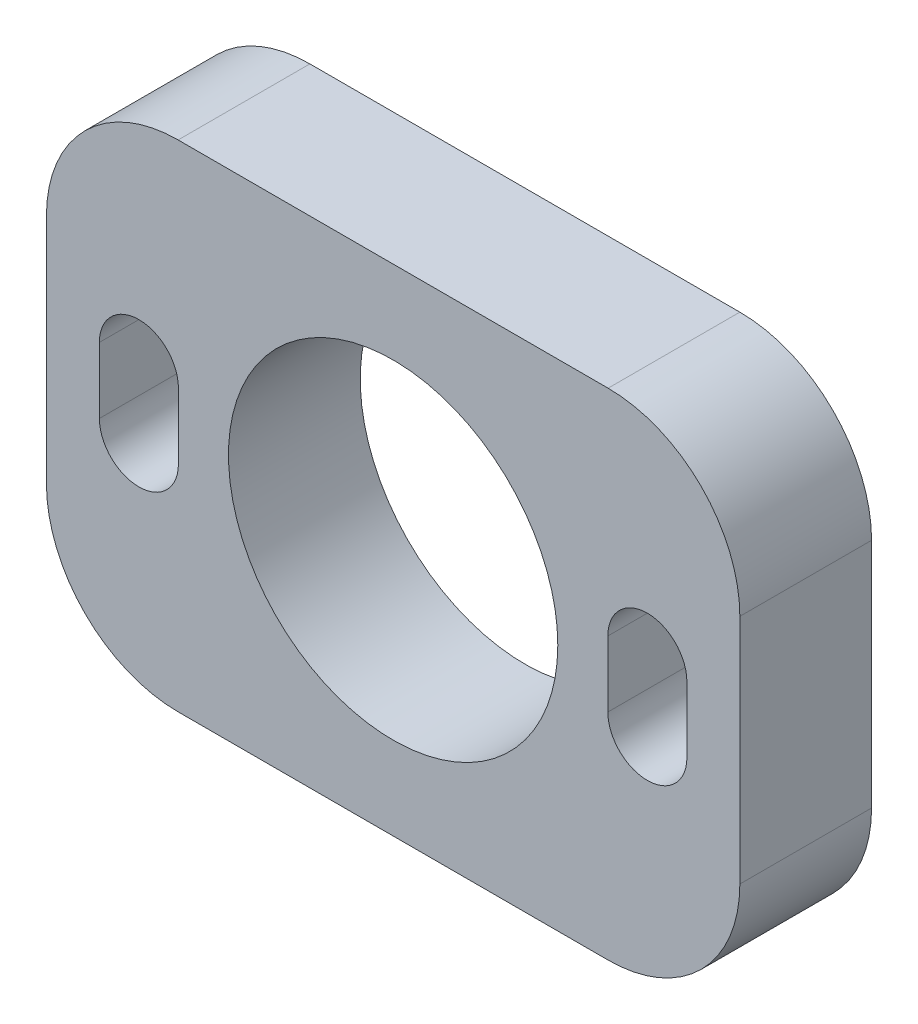
ISO-10303-21;
HEADER;
FILE_DESCRIPTION(('STEP AP214'),'2;1');
FILE_NAME('part.step','',(''),(''),'','','');
FILE_SCHEMA(('AUTOMOTIVE_DESIGN { 1 0 10303 214 1 1 1 1 }'));
ENDSEC;
DATA;
#1=APPLICATION_CONTEXT('core data for automotive mechanical design processes');
#2=APPLICATION_PROTOCOL_DEFINITION('international standard','automotive_design',2000,#1);
#3=PRODUCT_CONTEXT('',#1,'mechanical');
#4=PRODUCT('Part','Part','',(#3));
#5=PRODUCT_RELATED_PRODUCT_CATEGORY('part','',(#4));
#6=PRODUCT_DEFINITION_FORMATION('','',#4);
#7=PRODUCT_DEFINITION_CONTEXT('part definition',#1,'design');
#8=PRODUCT_DEFINITION('design','',#6,#7);
#9=PRODUCT_DEFINITION_SHAPE('','',#8);
#10=(LENGTH_UNIT() NAMED_UNIT(*) SI_UNIT(.MILLI.,.METRE.));
#11=(NAMED_UNIT(*) PLANE_ANGLE_UNIT() SI_UNIT($,.RADIAN.));
#12=(NAMED_UNIT(*) SI_UNIT($,.STERADIAN.) SOLID_ANGLE_UNIT());
#13=UNCERTAINTY_MEASURE_WITH_UNIT(LENGTH_MEASURE(1.E-05),#10,'distance_accuracy_value','');
#14=(GEOMETRIC_REPRESENTATION_CONTEXT(3) GLOBAL_UNCERTAINTY_ASSIGNED_CONTEXT((#13)) GLOBAL_UNIT_ASSIGNED_CONTEXT((#10,
#11,#12)) REPRESENTATION_CONTEXT('',''));
#15=CARTESIAN_POINT('',(0.,0.,0.));
#16=DIRECTION('',(0.,0.,1.));
#17=DIRECTION('',(1.,0.,0.));
#18=AXIS2_PLACEMENT_3D('',#15,#16,#17);
#19=CARTESIAN_POINT('',(27.559822218472,26.2909678017719,-88.6894036822282));
#20=DIRECTION('',(0.,0.,-1.));
#21=DIRECTION('',(-1.,0.,0.));
#22=AXIS2_PLACEMENT_3D('',#19,#20,#21);
#23=CYLINDRICAL_SURFACE('',#22,1.905);
#24=CARTESIAN_POINT('',(27.559822218472,26.2909678017719,-95.0394036822282));
#25=DIRECTION('',(0.,0.,1.));
#26=DIRECTION('',(1.,0.,0.));
#27=AXIS2_PLACEMENT_3D('',#24,#25,#26);
#28=CIRCLE('',#27,1.905);
#29=CARTESIAN_POINT('',(29.464822218472,26.2909678017719,-95.0394036822282));
#30=VERTEX_POINT('',#29);
#31=CARTESIAN_POINT('',(25.654822218472,26.2909678017719,-95.0394036822282));
#32=VERTEX_POINT('',#31);
#33=EDGE_CURVE('E222',#30,#32,#28,.T.);
#34=ORIENTED_EDGE('',*,*,#33,.F.);
#35=DIRECTION('',(0.,0.,-1.));
#36=VECTOR('',#35,1.);
#37=CARTESIAN_POINT('',(29.464822218472,26.2909678017719,-88.6894036822282));
#38=LINE('',#37,#36);
#39=CARTESIAN_POINT('',(29.464822218472,26.2909678017719,-88.6894036822282));
#40=VERTEX_POINT('',#39);
#41=EDGE_CURVE('E239',#40,#30,#38,.T.);
#42=ORIENTED_EDGE('',*,*,#41,.F.);
#43=CARTESIAN_POINT('',(27.559822218472,26.2909678017719,-88.6894036822282));
#44=DIRECTION('',(0.,0.,1.));
#45=DIRECTION('',(1.,0.,0.));
#46=AXIS2_PLACEMENT_3D('',#43,#44,#45);
#47=CIRCLE('',#46,1.905);
#48=CARTESIAN_POINT('',(25.654822218472,26.2909678017719,-88.6894036822282));
#49=VERTEX_POINT('',#48);
#50=EDGE_CURVE('E187',#40,#49,#47,.T.);
#51=ORIENTED_EDGE('',*,*,#50,.T.);
#52=DIRECTION('',(0.,0.,-1.));
#53=VECTOR('',#52,1.);
#54=CARTESIAN_POINT('',(25.654822218472,26.2909678017719,-88.6894036822282));
#55=LINE('',#54,#53);
#56=EDGE_CURVE('E156',#49,#32,#55,.T.);
#57=ORIENTED_EDGE('',*,*,#56,.T.);
#58=EDGE_LOOP('',(#34,#42,#51,#57));
#59=FACE_BOUND('',#58,.T.);
#60=ADVANCED_FACE('F32',(#59),#23,.F.);
#61=CARTESIAN_POINT('',(29.464822218472,0.,-88.6894036822282));
#62=DIRECTION('',(1.,0.,0.));
#63=DIRECTION('',(0.,0.,-1.));
#64=AXIS2_PLACEMENT_3D('',#61,#62,#63);
#65=PLANE('',#64);
#66=DIRECTION('',(0.,-1.,0.));
#67=VECTOR('',#66,1.);
#68=CARTESIAN_POINT('',(29.464822218472,0.,-95.0394036822282));
#69=LINE('',#68,#67);
#70=CARTESIAN_POINT('',(29.464822218472,23.115967801772,-95.0394036822282));
#71=VERTEX_POINT('',#70);
#72=EDGE_CURVE('E225',#30,#71,#69,.T.);
#73=ORIENTED_EDGE('',*,*,#72,.T.);
#74=DIRECTION('',(0.,0.,-1.));
#75=VECTOR('',#74,1.);
#76=CARTESIAN_POINT('',(29.464822218472,23.115967801772,-88.6894036822282));
#77=LINE('',#76,#75);
#78=CARTESIAN_POINT('',(29.464822218472,23.115967801772,-88.6894036822282));
#79=VERTEX_POINT('',#78);
#80=EDGE_CURVE('E237',#79,#71,#77,.T.);
#81=ORIENTED_EDGE('',*,*,#80,.F.);
#82=DIRECTION('',(0.,-1.,0.));
#83=VECTOR('',#82,1.);
#84=CARTESIAN_POINT('',(29.464822218472,0.,-88.6894036822282));
#85=LINE('',#84,#83);
#86=EDGE_CURVE('E190',#40,#79,#85,.T.);
#87=ORIENTED_EDGE('',*,*,#86,.F.);
#88=ORIENTED_EDGE('',*,*,#41,.T.);
#89=EDGE_LOOP('',(#73,#81,#87,#88));
#90=FACE_BOUND('',#89,.T.);
#91=ADVANCED_FACE('F314',(#90),#65,.F.);
#92=CARTESIAN_POINT('',(27.559822218472,23.115967801772,-88.6894036822282));
#93=DIRECTION('',(0.,0.,-1.));
#94=DIRECTION('',(-1.,0.,0.));
#95=AXIS2_PLACEMENT_3D('',#92,#93,#94);
#96=CYLINDRICAL_SURFACE('',#95,1.905);
#97=CARTESIAN_POINT('',(27.559822218472,23.115967801772,-95.0394036822282));
#98=DIRECTION('',(0.,0.,1.));
#99=DIRECTION('',(1.,0.,0.));
#100=AXIS2_PLACEMENT_3D('',#97,#98,#99);
#101=CIRCLE('',#100,1.905);
#102=CARTESIAN_POINT('',(25.654822218472,23.115967801772,-95.0394036822282));
#103=VERTEX_POINT('',#102);
#104=EDGE_CURVE('E228',#103,#71,#101,.T.);
#105=ORIENTED_EDGE('',*,*,#104,.F.);
#106=DIRECTION('',(0.,0.,-1.));
#107=VECTOR('',#106,1.);
#108=CARTESIAN_POINT('',(25.654822218472,23.115967801772,-88.6894036822282));
#109=LINE('',#108,#107);
#110=CARTESIAN_POINT('',(25.654822218472,23.115967801772,-88.6894036822282));
#111=VERTEX_POINT('',#110);
#112=EDGE_CURVE('E235',#111,#103,#109,.T.);
#113=ORIENTED_EDGE('',*,*,#112,.F.);
#114=CARTESIAN_POINT('',(27.559822218472,23.115967801772,-88.6894036822282));
#115=DIRECTION('',(0.,0.,1.));
#116=DIRECTION('',(1.,0.,0.));
#117=AXIS2_PLACEMENT_3D('',#114,#115,#116);
#118=CIRCLE('',#117,1.905);
#119=EDGE_CURVE('E192',#111,#79,#118,.T.);
#120=ORIENTED_EDGE('',*,*,#119,.T.);
#121=ORIENTED_EDGE('',*,*,#80,.T.);
#122=EDGE_LOOP('',(#105,#113,#120,#121));
#123=FACE_BOUND('',#122,.T.);
#124=ADVANCED_FACE('F320',(#123),#96,.F.);
#125=CARTESIAN_POINT('',(32.017522218472,0.,-88.6894036822282));
#126=DIRECTION('',(1.,0.,0.));
#127=DIRECTION('',(0.,0.,-1.));
#128=AXIS2_PLACEMENT_3D('',#125,#126,#127);
#129=PLANE('',#128);
#130=DIRECTION('',(0.,-1.,0.));
#131=VECTOR('',#130,1.);
#132=CARTESIAN_POINT('',(32.017522218472,0.,-95.0394036822282));
#133=LINE('',#132,#131);
#134=CARTESIAN_POINT('',(32.017522218472,30.291467801772,-95.0394036822282));
#135=VERTEX_POINT('',#134);
#136=CARTESIAN_POINT('',(32.017522218472,19.115467801772,-95.0394036822282));
#137=VERTEX_POINT('',#136);
#138=EDGE_CURVE('E211',#135,#137,#133,.T.);
#139=ORIENTED_EDGE('',*,*,#138,.F.);
#140=DIRECTION('',(0.,0.,-1.));
#141=VECTOR('',#140,1.);
#142=CARTESIAN_POINT('',(32.017522218472,30.291467801772,-88.6894036822282));
#143=LINE('',#142,#141);
#144=CARTESIAN_POINT('',(32.017522218472,30.291467801772,-88.6894036822282));
#145=VERTEX_POINT('',#144);
#146=EDGE_CURVE('E261',#135,#145,#143,.F.);
#147=ORIENTED_EDGE('',*,*,#146,.T.);
#148=DIRECTION('',(0.,-1.,0.));
#149=VECTOR('',#148,1.);
#150=CARTESIAN_POINT('',(32.017522218472,0.,-88.6894036822282));
#151=LINE('',#150,#149);
#152=CARTESIAN_POINT('',(32.017522218472,19.115467801772,-88.6894036822282));
#153=VERTEX_POINT('',#152);
#154=EDGE_CURVE('E177',#145,#153,#151,.T.);
#155=ORIENTED_EDGE('',*,*,#154,.T.);
#156=DIRECTION('',(0.,0.,-1.));
#157=VECTOR('',#156,1.);
#158=CARTESIAN_POINT('',(32.017522218472,19.115467801772,-95.0394036822282));
#159=LINE('',#158,#157);
#160=EDGE_CURVE('E258',#153,#137,#159,.T.);
#161=ORIENTED_EDGE('',*,*,#160,.T.);
#162=EDGE_LOOP('',(#139,#147,#155,#161));
#163=FACE_BOUND('',#162,.T.);
#164=ADVANCED_FACE('F299',(#163),#129,.T.);
#165=CARTESIAN_POINT('',(0.,36.641467801772,-88.6894036822282));
#166=DIRECTION('',(0.,1.,0.));
#167=DIRECTION('',(0.,0.,1.));
#168=AXIS2_PLACEMENT_3D('',#165,#166,#167);
#169=PLANE('',#168);
#170=DIRECTION('',(1.,0.,0.));
#171=VECTOR('',#170,1.);
#172=CARTESIAN_POINT('',(0.,36.641467801772,-88.6894036822282));
#173=LINE('',#172,#171);
#174=CARTESIAN_POINT('',(4.94112221847201,36.641467801772,-88.6894036822282));
#175=VERTEX_POINT('',#174);
#176=CARTESIAN_POINT('',(25.667522218472,36.641467801772,-88.6894036822282));
#177=VERTEX_POINT('',#176);
#178=EDGE_CURVE('E180',#175,#177,#173,.T.);
#179=ORIENTED_EDGE('',*,*,#178,.T.);
#180=DIRECTION('',(0.,0.,-1.));
#181=VECTOR('',#180,1.);
#182=CARTESIAN_POINT('',(25.667522218472,36.641467801772,-88.6894036822282));
#183=LINE('',#182,#181);
#184=CARTESIAN_POINT('',(25.667522218472,36.641467801772,-95.0394036822282));
#185=VERTEX_POINT('',#184);
#186=EDGE_CURVE('E247',#177,#185,#183,.T.);
#187=ORIENTED_EDGE('',*,*,#186,.T.);
#188=DIRECTION('',(1.,0.,0.));
#189=VECTOR('',#188,1.);
#190=CARTESIAN_POINT('',(0.,36.641467801772,-95.0394036822282));
#191=LINE('',#190,#189);
#192=CARTESIAN_POINT('',(4.94112221847201,36.641467801772,-95.0394036822282));
#193=VERTEX_POINT('',#192);
#194=EDGE_CURVE('E214',#193,#185,#191,.T.);
#195=ORIENTED_EDGE('',*,*,#194,.F.);
#196=DIRECTION('',(0.,0.,-1.));
#197=VECTOR('',#196,1.);
#198=CARTESIAN_POINT('',(4.94112221847201,36.641467801772,-88.6894036822282));
#199=LINE('',#198,#197);
#200=EDGE_CURVE('E241',#193,#175,#199,.F.);
#201=ORIENTED_EDGE('',*,*,#200,.T.);
#202=EDGE_LOOP('',(#179,#187,#195,#201));
#203=FACE_BOUND('',#202,.T.);
#204=ADVANCED_FACE('F306',(#203),#169,.T.);
#205=CARTESIAN_POINT('',(-1.40887778152798,0.,-88.6894036822282));
#206=DIRECTION('',(1.,0.,0.));
#207=DIRECTION('',(0.,1.,0.));
#208=AXIS2_PLACEMENT_3D('',#205,#206,#207);
#209=PLANE('',#208);
#210=DIRECTION('',(0.,-1.,0.));
#211=VECTOR('',#210,1.);
#212=CARTESIAN_POINT('',(-1.40887778152798,0.,-95.0394036822282));
#213=LINE('',#212,#211);
#214=CARTESIAN_POINT('',(-1.40887778152799,30.291467801772,-95.0394036822282));
#215=VERTEX_POINT('',#214);
#216=CARTESIAN_POINT('',(-1.40887778152798,19.115467801772,-95.0394036822282));
#217=VERTEX_POINT('',#216);
#218=EDGE_CURVE('E217',#215,#217,#213,.T.);
#219=ORIENTED_EDGE('',*,*,#218,.T.);
#220=DIRECTION('',(0.,0.,-1.));
#221=VECTOR('',#220,1.);
#222=CARTESIAN_POINT('',(-1.40887778152798,19.115467801772,-88.6894036822282));
#223=LINE('',#222,#221);
#224=CARTESIAN_POINT('',(-1.40887778152798,19.115467801772,-88.6894036822282));
#225=VERTEX_POINT('',#224);
#226=EDGE_CURVE('E11',#217,#225,#223,.F.);
#227=ORIENTED_EDGE('',*,*,#226,.T.);
#228=DIRECTION('',(0.,-1.,0.));
#229=VECTOR('',#228,1.);
#230=CARTESIAN_POINT('',(-1.40887778152798,0.,-88.6894036822282));
#231=LINE('',#230,#229);
#232=CARTESIAN_POINT('',(-1.40887778152799,30.291467801772,-88.6894036822282));
#233=VERTEX_POINT('',#232);
#234=EDGE_CURVE('E183',#233,#225,#231,.T.);
#235=ORIENTED_EDGE('',*,*,#234,.F.);
#236=DIRECTION('',(0.,0.,-1.));
#237=VECTOR('',#236,1.);
#238=CARTESIAN_POINT('',(-1.40887778152799,30.291467801772,-95.0394036822282));
#239=LINE('',#238,#237);
#240=EDGE_CURVE('E40',#233,#215,#239,.T.);
#241=ORIENTED_EDGE('',*,*,#240,.T.);
#242=EDGE_LOOP('',(#219,#227,#235,#241));
#243=FACE_BOUND('',#242,.T.);
#244=ADVANCED_FACE('F278',(#243),#209,.F.);
#245=CARTESIAN_POINT('',(3.04882221847201,23.115967801772,-88.6894036822282));
#246=DIRECTION('',(0.,0.,-1.));
#247=DIRECTION('',(-1.,0.,0.));
#248=AXIS2_PLACEMENT_3D('',#245,#246,#247);
#249=CYLINDRICAL_SURFACE('',#248,1.905);
#250=CARTESIAN_POINT('',(3.04882221847201,23.115967801772,-95.0394036822282));
#251=DIRECTION('',(0.,0.,1.));
#252=DIRECTION('',(1.,0.,0.));
#253=AXIS2_PLACEMENT_3D('',#250,#251,#252);
#254=CIRCLE('',#253,1.905);
#255=CARTESIAN_POINT('',(1.14382221847201,23.115967801772,-95.0394036822282));
#256=VERTEX_POINT('',#255);
#257=CARTESIAN_POINT('',(4.95382221847201,23.115967801772,-95.0394036822282));
#258=VERTEX_POINT('',#257);
#259=EDGE_CURVE('E151',#256,#258,#254,.T.);
#260=ORIENTED_EDGE('',*,*,#259,.F.);
#261=DIRECTION('',(0.,0.,-1.));
#262=VECTOR('',#261,1.);
#263=CARTESIAN_POINT('',(1.14382221847201,23.115967801772,-88.6894036822282));
#264=LINE('',#263,#262);
#265=CARTESIAN_POINT('',(1.14382221847201,23.115967801772,-88.6894036822282));
#266=VERTEX_POINT('',#265);
#267=EDGE_CURVE('E146',#266,#256,#264,.T.);
#268=ORIENTED_EDGE('',*,*,#267,.F.);
#269=CARTESIAN_POINT('',(3.04882221847201,23.115967801772,-88.6894036822282));
#270=DIRECTION('',(0.,0.,1.));
#271=DIRECTION('',(1.,0.,0.));
#272=AXIS2_PLACEMENT_3D('',#269,#270,#271);
#273=CIRCLE('',#272,1.905);
#274=CARTESIAN_POINT('',(4.95382221847201,23.115967801772,-88.6894036822282));
#275=VERTEX_POINT('',#274);
#276=EDGE_CURVE('E149',#266,#275,#273,.T.);
#277=ORIENTED_EDGE('',*,*,#276,.T.);
#278=DIRECTION('',(0.,0.,-1.));
#279=VECTOR('',#278,1.);
#280=CARTESIAN_POINT('',(4.95382221847201,23.115967801772,-88.6894036822282));
#281=LINE('',#280,#279);
#282=EDGE_CURVE('E198',#275,#258,#281,.T.);
#283=ORIENTED_EDGE('',*,*,#282,.T.);
#284=EDGE_LOOP('',(#260,#268,#277,#283));
#285=FACE_BOUND('',#284,.T.);
#286=ADVANCED_FACE('F148',(#285),#249,.F.);
#287=CARTESIAN_POINT('',(1.14382221847201,0.,-88.6894036822282));
#288=DIRECTION('',(1.,0.,0.));
#289=DIRECTION('',(0.,0.,-1.));
#290=AXIS2_PLACEMENT_3D('',#287,#288,#289);
#291=PLANE('',#290);
#292=DIRECTION('',(0.,-1.,0.));
#293=VECTOR('',#292,1.);
#294=CARTESIAN_POINT('',(1.14382221847201,0.,-95.0394036822282));
#295=LINE('',#294,#293);
#296=CARTESIAN_POINT('',(1.14382221847201,26.2909678017719,-95.0394036822282));
#297=VERTEX_POINT('',#296);
#298=EDGE_CURVE('E203',#297,#256,#295,.T.);
#299=ORIENTED_EDGE('',*,*,#298,.F.);
#300=DIRECTION('',(0.,0.,-1.));
#301=VECTOR('',#300,1.);
#302=CARTESIAN_POINT('',(1.14382221847201,26.2909678017719,-88.6894036822282));
#303=LINE('',#302,#301);
#304=CARTESIAN_POINT('',(1.14382221847201,26.2909678017719,-88.6894036822282));
#305=VERTEX_POINT('',#304);
#306=EDGE_CURVE('E157',#305,#297,#303,.T.);
#307=ORIENTED_EDGE('',*,*,#306,.F.);
#308=DIRECTION('',(0.,-1.,0.));
#309=VECTOR('',#308,1.);
#310=CARTESIAN_POINT('',(1.14382221847201,0.,-88.6894036822282));
#311=LINE('',#310,#309);
#312=EDGE_CURVE('E163',#305,#266,#311,.T.);
#313=ORIENTED_EDGE('',*,*,#312,.T.);
#314=ORIENTED_EDGE('',*,*,#267,.T.);
#315=EDGE_LOOP('',(#299,#307,#313,#314));
#316=FACE_BOUND('',#315,.T.);
#317=ADVANCED_FACE('F170',(#316),#291,.T.);
#318=CARTESIAN_POINT('',(3.04882221847201,26.2909678017719,-88.6894036822282));
#319=DIRECTION('',(0.,0.,-1.));
#320=DIRECTION('',(-1.,0.,0.));
#321=AXIS2_PLACEMENT_3D('',#318,#319,#320);
#322=CYLINDRICAL_SURFACE('',#321,1.905);
#323=CARTESIAN_POINT('',(3.04882221847201,26.2909678017719,-95.0394036822282));
#324=DIRECTION('',(0.,0.,1.));
#325=DIRECTION('',(1.,0.,0.));
#326=AXIS2_PLACEMENT_3D('',#323,#324,#325);
#327=CIRCLE('',#326,1.905);
#328=CARTESIAN_POINT('',(4.95382221847201,26.2909678017719,-95.0394036822282));
#329=VERTEX_POINT('',#328);
#330=EDGE_CURVE('E205',#329,#297,#327,.T.);
#331=ORIENTED_EDGE('',*,*,#330,.F.);
#332=DIRECTION('',(0.,0.,-1.));
#333=VECTOR('',#332,1.);
#334=CARTESIAN_POINT('',(4.95382221847201,26.2909678017719,-88.6894036822282));
#335=LINE('',#334,#333);
#336=CARTESIAN_POINT('',(4.95382221847201,26.2909678017719,-88.6894036822282));
#337=VERTEX_POINT('',#336);
#338=EDGE_CURVE('E243',#337,#329,#335,.T.);
#339=ORIENTED_EDGE('',*,*,#338,.F.);
#340=CARTESIAN_POINT('',(3.04882221847201,26.2909678017719,-88.6894036822282));
#341=DIRECTION('',(0.,0.,1.));
#342=DIRECTION('',(1.,0.,0.));
#343=AXIS2_PLACEMENT_3D('',#340,#341,#342);
#344=CIRCLE('',#343,1.905);
#345=EDGE_CURVE('E171',#337,#305,#344,.T.);
#346=ORIENTED_EDGE('',*,*,#345,.T.);
#347=ORIENTED_EDGE('',*,*,#306,.T.);
#348=EDGE_LOOP('',(#331,#339,#346,#347));
#349=FACE_BOUND('',#348,.T.);
#350=ADVANCED_FACE('F329',(#349),#322,.F.);
#351=CARTESIAN_POINT('',(0.,12.7654678017719,-88.6894036822282));
#352=DIRECTION('',(0.,1.,0.));
#353=DIRECTION('',(0.,0.,1.));
#354=AXIS2_PLACEMENT_3D('',#351,#352,#353);
#355=PLANE('',#354);
#356=DIRECTION('',(1.,0.,0.));
#357=VECTOR('',#356,1.);
#358=CARTESIAN_POINT('',(0.,12.7654678017719,-95.0394036822282));
#359=LINE('',#358,#357);
#360=CARTESIAN_POINT('',(4.94112221847201,12.7654678017719,-95.0394036822282));
#361=VERTEX_POINT('',#360);
#362=CARTESIAN_POINT('',(25.667522218472,12.7654678017719,-95.0394036822282));
#363=VERTEX_POINT('',#362);
#364=EDGE_CURVE('E220',#361,#363,#359,.T.);
#365=ORIENTED_EDGE('',*,*,#364,.T.);
#366=DIRECTION('',(0.,0.,-1.));
#367=VECTOR('',#366,1.);
#368=CARTESIAN_POINT('',(25.667522218472,12.7654678017719,-88.6894036822282));
#369=LINE('',#368,#367);
#370=CARTESIAN_POINT('',(25.667522218472,12.7654678017719,-88.6894036822282));
#371=VERTEX_POINT('',#370);
#372=EDGE_CURVE('E47',#363,#371,#369,.F.);
#373=ORIENTED_EDGE('',*,*,#372,.T.);
#374=DIRECTION('',(1.,0.,0.));
#375=VECTOR('',#374,1.);
#376=CARTESIAN_POINT('',(0.,12.7654678017719,-88.6894036822282));
#377=LINE('',#376,#375);
#378=CARTESIAN_POINT('',(4.94112221847201,12.7654678017719,-88.6894036822282));
#379=VERTEX_POINT('',#378);
#380=EDGE_CURVE('E185',#379,#371,#377,.T.);
#381=ORIENTED_EDGE('',*,*,#380,.F.);
#382=DIRECTION('',(0.,0.,-1.));
#383=VECTOR('',#382,1.);
#384=CARTESIAN_POINT('',(4.94112221847201,12.7654678017719,-88.6894036822282));
#385=LINE('',#384,#383);
#386=EDGE_CURVE('E270',#379,#361,#385,.T.);
#387=ORIENTED_EDGE('',*,*,#386,.T.);
#388=EDGE_LOOP('',(#365,#373,#381,#387));
#389=FACE_BOUND('',#388,.T.);
#390=ADVANCED_FACE('F290',(#389),#355,.F.);
#391=CARTESIAN_POINT('',(4.95382221847201,0.,-88.6894036822282));
#392=DIRECTION('',(1.,0.,0.));
#393=DIRECTION('',(0.,0.,-1.));
#394=AXIS2_PLACEMENT_3D('',#391,#392,#393);
#395=PLANE('',#394);
#396=DIRECTION('',(0.,-1.,0.));
#397=VECTOR('',#396,1.);
#398=CARTESIAN_POINT('',(4.95382221847201,0.,-95.0394036822282));
#399=LINE('',#398,#397);
#400=EDGE_CURVE('E208',#329,#258,#399,.T.);
#401=ORIENTED_EDGE('',*,*,#400,.T.);
#402=ORIENTED_EDGE('',*,*,#282,.F.);
#403=DIRECTION('',(0.,-1.,0.));
#404=VECTOR('',#403,1.);
#405=CARTESIAN_POINT('',(4.95382221847201,0.,-88.6894036822282));
#406=LINE('',#405,#404);
#407=EDGE_CURVE('E166',#337,#275,#406,.T.);
#408=ORIENTED_EDGE('',*,*,#407,.F.);
#409=ORIENTED_EDGE('',*,*,#338,.T.);
#410=EDGE_LOOP('',(#401,#402,#408,#409));
#411=FACE_BOUND('',#410,.T.);
#412=ADVANCED_FACE('F328',(#411),#395,.F.);
#413=CARTESIAN_POINT('',(15.304322218472,24.703467801772,-88.6894036822282));
#414=DIRECTION('',(0.,0.,-1.));
#415=DIRECTION('',(-1.,0.,0.));
#416=AXIS2_PLACEMENT_3D('',#413,#414,#415);
#417=CYLINDRICAL_SURFACE('',#416,7.9375);
#418=CARTESIAN_POINT('',(15.304322218472,24.703467801772,-88.6894036822282));
#419=DIRECTION('',(0.,0.,1.));
#420=DIRECTION('',(1.,0.,0.));
#421=AXIS2_PLACEMENT_3D('',#418,#419,#420);
#422=CIRCLE('',#421,7.9375);
#423=CARTESIAN_POINT('',(23.241822218472,24.703467801772,-88.6894036822282));
#424=VERTEX_POINT('',#423);
#425=EDGE_CURVE('E168',#424,#424,#422,.T.);
#426=ORIENTED_EDGE('',*,*,#425,.T.);
#427=EDGE_LOOP('',(#426));
#428=FACE_BOUND('',#427,.T.);
#429=CARTESIAN_POINT('',(15.304322218472,24.703467801772,-95.0394036822282));
#430=DIRECTION('',(0.,0.,1.));
#431=DIRECTION('',(1.,0.,0.));
#432=AXIS2_PLACEMENT_3D('',#429,#430,#431);
#433=CIRCLE('',#432,7.9375);
#434=CARTESIAN_POINT('',(23.241822218472,24.703467801772,-95.0394036822282));
#435=VERTEX_POINT('',#434);
#436=EDGE_CURVE('E199',#435,#435,#433,.T.);
#437=ORIENTED_EDGE('',*,*,#436,.F.);
#438=EDGE_LOOP('',(#437));
#439=FACE_BOUND('',#438,.T.);
#440=ADVANCED_FACE('F338',(#428,#439),#417,.F.);
#441=CARTESIAN_POINT('',(25.654822218472,0.,-88.6894036822282));
#442=DIRECTION('',(1.,0.,0.));
#443=DIRECTION('',(0.,0.,-1.));
#444=AXIS2_PLACEMENT_3D('',#441,#442,#443);
#445=PLANE('',#444);
#446=DIRECTION('',(0.,-1.,0.));
#447=VECTOR('',#446,1.);
#448=CARTESIAN_POINT('',(25.654822218472,0.,-95.0394036822282));
#449=LINE('',#448,#447);
#450=EDGE_CURVE('E231',#32,#103,#449,.T.);
#451=ORIENTED_EDGE('',*,*,#450,.F.);
#452=ORIENTED_EDGE('',*,*,#56,.F.);
#453=DIRECTION('',(0.,-1.,0.));
#454=VECTOR('',#453,1.);
#455=CARTESIAN_POINT('',(25.654822218472,0.,-88.6894036822282));
#456=LINE('',#455,#454);
#457=EDGE_CURVE('E195',#49,#111,#456,.T.);
#458=ORIENTED_EDGE('',*,*,#457,.T.);
#459=ORIENTED_EDGE('',*,*,#112,.T.);
#460=EDGE_LOOP('',(#451,#452,#458,#459));
#461=FACE_BOUND('',#460,.T.);
#462=ADVANCED_FACE('F349',(#461),#445,.T.);
#463=CARTESIAN_POINT('',(0.,0.,-88.6894036822282));
#464=DIRECTION('',(0.,0.,1.));
#465=DIRECTION('',(1.,0.,0.));
#466=AXIS2_PLACEMENT_3D('',#463,#464,#465);
#467=PLANE('',#466);
#468=ORIENTED_EDGE('',*,*,#425,.F.);
#469=EDGE_LOOP('',(#468));
#470=FACE_BOUND('',#469,.T.);
#471=ORIENTED_EDGE('',*,*,#276,.F.);
#472=ORIENTED_EDGE('',*,*,#312,.F.);
#473=ORIENTED_EDGE('',*,*,#345,.F.);
#474=ORIENTED_EDGE('',*,*,#407,.T.);
#475=EDGE_LOOP('',(#471,#472,#473,#474));
#476=FACE_BOUND('',#475,.T.);
#477=ORIENTED_EDGE('',*,*,#154,.F.);
#478=CARTESIAN_POINT('',(25.667522218472,30.291467801772,-88.6894036822282));
#479=DIRECTION('',(0.,0.,1.));
#480=DIRECTION('',(1.,0.,0.));
#481=AXIS2_PLACEMENT_3D('',#478,#479,#480);
#482=CIRCLE('',#481,6.35);
#483=EDGE_CURVE('E268',#145,#177,#482,.T.);
#484=ORIENTED_EDGE('',*,*,#483,.T.);
#485=ORIENTED_EDGE('',*,*,#178,.F.);
#486=CARTESIAN_POINT('',(4.94112221847201,30.291467801772,-88.6894036822282));
#487=DIRECTION('',(0.,0.,1.));
#488=DIRECTION('',(1.,0.,0.));
#489=AXIS2_PLACEMENT_3D('',#486,#487,#488);
#490=CIRCLE('',#489,6.35);
#491=EDGE_CURVE('E263',#175,#233,#490,.T.);
#492=ORIENTED_EDGE('',*,*,#491,.T.);
#493=ORIENTED_EDGE('',*,*,#234,.T.);
#494=CARTESIAN_POINT('',(4.94112221847201,19.115467801772,-88.6894036822282));
#495=DIRECTION('',(0.,0.,1.));
#496=DIRECTION('',(1.,0.,0.));
#497=AXIS2_PLACEMENT_3D('',#494,#495,#496);
#498=CIRCLE('',#497,6.35);
#499=EDGE_CURVE('E54',#225,#379,#498,.T.);
#500=ORIENTED_EDGE('',*,*,#499,.T.);
#501=ORIENTED_EDGE('',*,*,#380,.T.);
#502=CARTESIAN_POINT('',(25.667522218472,19.115467801772,-88.6894036822282));
#503=DIRECTION('',(0.,0.,1.));
#504=DIRECTION('',(1.,0.,0.));
#505=AXIS2_PLACEMENT_3D('',#502,#503,#504);
#506=CIRCLE('',#505,6.35);
#507=EDGE_CURVE('E266',#371,#153,#506,.T.);
#508=ORIENTED_EDGE('',*,*,#507,.T.);
#509=EDGE_LOOP('',(#477,#484,#485,#492,#493,#500,#501,#508));
#510=FACE_BOUND('',#509,.T.);
#511=ORIENTED_EDGE('',*,*,#50,.F.);
#512=ORIENTED_EDGE('',*,*,#86,.T.);
#513=ORIENTED_EDGE('',*,*,#119,.F.);
#514=ORIENTED_EDGE('',*,*,#457,.F.);
#515=EDGE_LOOP('',(#511,#512,#513,#514));
#516=FACE_BOUND('',#515,.T.);
#517=ADVANCED_FACE('F161',(#470,#476,#510,#516),#467,.T.);
#518=CARTESIAN_POINT('',(0.,0.,-95.0394036822282));
#519=DIRECTION('',(0.,0.,1.));
#520=DIRECTION('',(1.,0.,0.));
#521=AXIS2_PLACEMENT_3D('',#518,#519,#520);
#522=PLANE('',#521);
#523=ORIENTED_EDGE('',*,*,#436,.T.);
#524=EDGE_LOOP('',(#523));
#525=FACE_BOUND('',#524,.T.);
#526=ORIENTED_EDGE('',*,*,#259,.T.);
#527=ORIENTED_EDGE('',*,*,#400,.F.);
#528=ORIENTED_EDGE('',*,*,#330,.T.);
#529=ORIENTED_EDGE('',*,*,#298,.T.);
#530=EDGE_LOOP('',(#526,#527,#528,#529));
#531=FACE_BOUND('',#530,.T.);
#532=ORIENTED_EDGE('',*,*,#194,.T.);
#533=CARTESIAN_POINT('',(25.667522218472,30.291467801772,-95.0394036822282));
#534=DIRECTION('',(0.,0.,1.));
#535=DIRECTION('',(1.,0.,0.));
#536=AXIS2_PLACEMENT_3D('',#533,#534,#535);
#537=CIRCLE('',#536,6.35);
#538=EDGE_CURVE('E256',#185,#135,#537,.F.);
#539=ORIENTED_EDGE('',*,*,#538,.T.);
#540=ORIENTED_EDGE('',*,*,#138,.T.);
#541=CARTESIAN_POINT('',(25.667522218472,19.115467801772,-95.0394036822282));
#542=DIRECTION('',(0.,0.,1.));
#543=DIRECTION('',(1.,0.,0.));
#544=AXIS2_PLACEMENT_3D('',#541,#542,#543);
#545=CIRCLE('',#544,6.35);
#546=EDGE_CURVE('E254',#137,#363,#545,.F.);
#547=ORIENTED_EDGE('',*,*,#546,.T.);
#548=ORIENTED_EDGE('',*,*,#364,.F.);
#549=CARTESIAN_POINT('',(4.94112221847201,19.115467801772,-95.0394036822282));
#550=DIRECTION('',(0.,0.,1.));
#551=DIRECTION('',(1.,0.,0.));
#552=AXIS2_PLACEMENT_3D('',#549,#550,#551);
#553=CIRCLE('',#552,6.35);
#554=EDGE_CURVE('E252',#361,#217,#553,.F.);
#555=ORIENTED_EDGE('',*,*,#554,.T.);
#556=ORIENTED_EDGE('',*,*,#218,.F.);
#557=CARTESIAN_POINT('',(4.94112221847201,30.291467801772,-95.0394036822282));
#558=DIRECTION('',(0.,0.,1.));
#559=DIRECTION('',(1.,0.,0.));
#560=AXIS2_PLACEMENT_3D('',#557,#558,#559);
#561=CIRCLE('',#560,6.35);
#562=EDGE_CURVE('E250',#215,#193,#561,.F.);
#563=ORIENTED_EDGE('',*,*,#562,.T.);
#564=EDGE_LOOP('',(#532,#539,#540,#547,#548,#555,#556,#563));
#565=FACE_BOUND('',#564,.T.);
#566=ORIENTED_EDGE('',*,*,#33,.T.);
#567=ORIENTED_EDGE('',*,*,#450,.T.);
#568=ORIENTED_EDGE('',*,*,#104,.T.);
#569=ORIENTED_EDGE('',*,*,#72,.F.);
#570=EDGE_LOOP('',(#566,#567,#568,#569));
#571=FACE_BOUND('',#570,.T.);
#572=ADVANCED_FACE('F283',(#525,#531,#565,#571),#522,.F.);
#573=CARTESIAN_POINT('',(25.667522218472,30.291467801772,-88.6894036822282));
#574=DIRECTION('',(0.,0.,-1.));
#575=DIRECTION('',(-1.,0.,0.));
#576=AXIS2_PLACEMENT_3D('',#573,#574,#575);
#577=CYLINDRICAL_SURFACE('',#576,6.35);
#578=ORIENTED_EDGE('',*,*,#483,.F.);
#579=ORIENTED_EDGE('',*,*,#146,.F.);
#580=ORIENTED_EDGE('',*,*,#538,.F.);
#581=ORIENTED_EDGE('',*,*,#186,.F.);
#582=EDGE_LOOP('',(#578,#579,#580,#581));
#583=FACE_BOUND('',#582,.T.);
#584=ADVANCED_FACE('F304',(#583),#577,.T.);
#585=CARTESIAN_POINT('',(25.667522218472,19.115467801772,-88.6894036822282));
#586=DIRECTION('',(0.,0.,1.));
#587=DIRECTION('',(1.,0.,0.));
#588=AXIS2_PLACEMENT_3D('',#585,#586,#587);
#589=CYLINDRICAL_SURFACE('',#588,6.35);
#590=ORIENTED_EDGE('',*,*,#507,.F.);
#591=ORIENTED_EDGE('',*,*,#372,.F.);
#592=ORIENTED_EDGE('',*,*,#546,.F.);
#593=ORIENTED_EDGE('',*,*,#160,.F.);
#594=EDGE_LOOP('',(#590,#591,#592,#593));
#595=FACE_BOUND('',#594,.T.);
#596=ADVANCED_FACE('F296',(#595),#589,.T.);
#597=CARTESIAN_POINT('',(4.94112221847201,19.115467801772,-88.6894036822282));
#598=DIRECTION('',(0.,0.,-1.));
#599=DIRECTION('',(-1.,0.,0.));
#600=AXIS2_PLACEMENT_3D('',#597,#598,#599);
#601=CYLINDRICAL_SURFACE('',#600,6.35);
#602=ORIENTED_EDGE('',*,*,#499,.F.);
#603=ORIENTED_EDGE('',*,*,#226,.F.);
#604=ORIENTED_EDGE('',*,*,#554,.F.);
#605=ORIENTED_EDGE('',*,*,#386,.F.);
#606=EDGE_LOOP('',(#602,#603,#604,#605));
#607=FACE_BOUND('',#606,.T.);
#608=ADVANCED_FACE('F289',(#607),#601,.T.);
#609=CARTESIAN_POINT('',(4.94112221847201,30.291467801772,-88.6894036822282));
#610=DIRECTION('',(0.,0.,1.));
#611=DIRECTION('',(1.,0.,0.));
#612=AXIS2_PLACEMENT_3D('',#609,#610,#611);
#613=CYLINDRICAL_SURFACE('',#612,6.35);
#614=ORIENTED_EDGE('',*,*,#491,.F.);
#615=ORIENTED_EDGE('',*,*,#200,.F.);
#616=ORIENTED_EDGE('',*,*,#562,.F.);
#617=ORIENTED_EDGE('',*,*,#240,.F.);
#618=EDGE_LOOP('',(#614,#615,#616,#617));
#619=FACE_BOUND('',#618,.T.);
#620=ADVANCED_FACE('F34',(#619),#613,.T.);
#621=CLOSED_SHELL('',(#60,#91,#124,#164,#204,#244,#286,#317,#350,#390,#412,#440,#462,#517,#572,
#584,#596,#608,#620));
#622=MANIFOLD_SOLID_BREP('B2',#621);
#623=ADVANCED_BREP_SHAPE_REPRESENTATION('',(#18,#622),#14);
#624=SHAPE_DEFINITION_REPRESENTATION(#9,#623);
ENDSEC;
END-ISO-10303-21;
